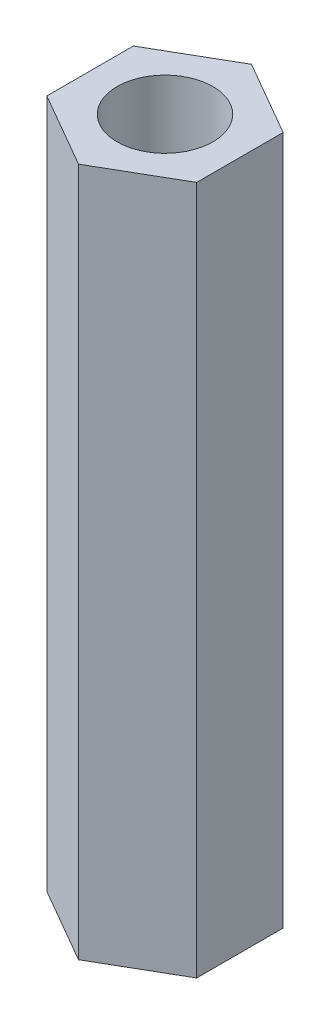
ISO-10303-21;
HEADER;
FILE_DESCRIPTION(('STEP AP214'),'2;1');
FILE_NAME('part.step','',(''),(''),'','','');
FILE_SCHEMA(('AUTOMOTIVE_DESIGN { 1 0 10303 214 1 1 1 1 }'));
ENDSEC;
DATA;
#1=APPLICATION_CONTEXT('core data for automotive mechanical design processes');
#2=APPLICATION_PROTOCOL_DEFINITION('international standard','automotive_design',2000,#1);
#3=PRODUCT_CONTEXT('',#1,'mechanical');
#4=PRODUCT('Part','Part','',(#3));
#5=PRODUCT_RELATED_PRODUCT_CATEGORY('part','',(#4));
#6=PRODUCT_DEFINITION_FORMATION('','',#4);
#7=PRODUCT_DEFINITION_CONTEXT('part definition',#1,'design');
#8=PRODUCT_DEFINITION('design','',#6,#7);
#9=PRODUCT_DEFINITION_SHAPE('','',#8);
#10=(LENGTH_UNIT() NAMED_UNIT(*) SI_UNIT(.MILLI.,.METRE.));
#11=(NAMED_UNIT(*) PLANE_ANGLE_UNIT() SI_UNIT($,.RADIAN.));
#12=(NAMED_UNIT(*) SI_UNIT($,.STERADIAN.) SOLID_ANGLE_UNIT());
#13=UNCERTAINTY_MEASURE_WITH_UNIT(LENGTH_MEASURE(1.E-05),#10,'distance_accuracy_value','');
#14=(GEOMETRIC_REPRESENTATION_CONTEXT(3) GLOBAL_UNCERTAINTY_ASSIGNED_CONTEXT((#13)) GLOBAL_UNIT_ASSIGNED_CONTEXT((#10,
#11,#12)) REPRESENTATION_CONTEXT('',''));
#15=CARTESIAN_POINT('',(0.,0.,0.));
#16=DIRECTION('',(0.,0.,1.));
#17=DIRECTION('',(1.,0.,0.));
#18=AXIS2_PLACEMENT_3D('',#15,#16,#17);
#19=CARTESIAN_POINT('',(0.,23.,0.));
#20=DIRECTION('',(0.,1.,0.));
#21=DIRECTION('',(0.,0.,1.));
#22=AXIS2_PLACEMENT_3D('',#19,#20,#21);
#23=PLANE('',#22);
#24=DIRECTION('',(-0.866025403784438,0.,-0.5));
#25=VECTOR('',#24,1.);
#26=CARTESIAN_POINT('',(2.57414627126051,23.,-2.48142347062101));
#27=LINE('',#26,#25);
#28=CARTESIAN_POINT('',(2.57414627126051,23.,-2.48142347062101));
#29=VERTEX_POINT('',#28);
#30=CARTESIAN_POINT('',(0.0741462712605112,23.,-3.92479914359508));
#31=VERTEX_POINT('',#30);
#32=EDGE_CURVE('E150',#29,#31,#27,.T.);
#33=ORIENTED_EDGE('',*,*,#32,.T.);
#34=DIRECTION('',(-0.866025403784439,0.,0.5));
#35=VECTOR('',#34,1.);
#36=CARTESIAN_POINT('',(0.0741462712605112,23.,-3.92479914359508));
#37=LINE('',#36,#35);
#38=CARTESIAN_POINT('',(-2.42585372873949,23.,-2.48142347062101));
#39=VERTEX_POINT('',#38);
#40=EDGE_CURVE('E98',#31,#39,#37,.T.);
#41=ORIENTED_EDGE('',*,*,#40,.T.);
#42=DIRECTION('',(0.,0.,1.));
#43=VECTOR('',#42,1.);
#44=CARTESIAN_POINT('',(-2.42585372873949,23.,-2.48142347062101));
#45=LINE('',#44,#43);
#46=CARTESIAN_POINT('',(-2.42585372873949,23.,0.405327875327116));
#47=VERTEX_POINT('',#46);
#48=EDGE_CURVE('E111',#39,#47,#45,.T.);
#49=ORIENTED_EDGE('',*,*,#48,.T.);
#50=DIRECTION('',(0.866025403784439,0.,0.5));
#51=VECTOR('',#50,1.);
#52=CARTESIAN_POINT('',(-2.42585372873949,23.,0.405327875327116));
#53=LINE('',#52,#51);
#54=CARTESIAN_POINT('',(0.0741462712605132,23.,1.84870354830118));
#55=VERTEX_POINT('',#54);
#56=EDGE_CURVE('E105',#47,#55,#53,.T.);
#57=ORIENTED_EDGE('',*,*,#56,.T.);
#58=DIRECTION('',(0.866025403784439,0.,-0.5));
#59=VECTOR('',#58,1.);
#60=CARTESIAN_POINT('',(0.0741462712605132,23.,1.84870354830118));
#61=LINE('',#60,#59);
#62=CARTESIAN_POINT('',(2.57414627126051,23.,0.405327875327117));
#63=VERTEX_POINT('',#62);
#64=EDGE_CURVE('E109',#55,#63,#61,.T.);
#65=ORIENTED_EDGE('',*,*,#64,.T.);
#66=DIRECTION('',(0.,0.,-1.));
#67=VECTOR('',#66,1.);
#68=CARTESIAN_POINT('',(2.57414627126051,23.,0.405327875327117));
#69=LINE('',#68,#67);
#70=EDGE_CURVE('E61',#63,#29,#69,.T.);
#71=ORIENTED_EDGE('',*,*,#70,.T.);
#72=EDGE_LOOP('',(#33,#41,#49,#57,#65,#71));
#73=FACE_BOUND('',#72,.T.);
#74=CARTESIAN_POINT('',(0.0741462712605112,23.,-1.03804779764695));
#75=DIRECTION('',(0.,1.,0.));
#76=DIRECTION('',(0.,0.,1.));
#77=AXIS2_PLACEMENT_3D('',#74,#75,#76);
#78=CIRCLE('',#77,1.6);
#79=CARTESIAN_POINT('',(0.0741462712605112,23.,0.561952202353051));
#80=VERTEX_POINT('',#79);
#81=EDGE_CURVE('E138',#80,#80,#78,.T.);
#82=ORIENTED_EDGE('',*,*,#81,.F.);
#83=EDGE_LOOP('',(#82));
#84=FACE_BOUND('',#83,.T.);
#85=ADVANCED_FACE('F43',(#73,#84),#23,.T.);
#86=CARTESIAN_POINT('',(0.,0.,0.));
#87=DIRECTION('',(0.,1.,0.));
#88=DIRECTION('',(0.,0.,1.));
#89=AXIS2_PLACEMENT_3D('',#86,#87,#88);
#90=PLANE('',#89);
#91=DIRECTION('',(-0.866025403784438,0.,-0.5));
#92=VECTOR('',#91,1.);
#93=CARTESIAN_POINT('',(2.57414627126051,0.,-2.48142347062101));
#94=LINE('',#93,#92);
#95=CARTESIAN_POINT('',(2.57414627126051,0.,-2.48142347062101));
#96=VERTEX_POINT('',#95);
#97=CARTESIAN_POINT('',(0.0741462712605112,0.,-3.92479914359508));
#98=VERTEX_POINT('',#97);
#99=EDGE_CURVE('E133',#96,#98,#94,.T.);
#100=ORIENTED_EDGE('',*,*,#99,.F.);
#101=DIRECTION('',(0.,0.,-1.));
#102=VECTOR('',#101,1.);
#103=CARTESIAN_POINT('',(2.57414627126051,0.,0.405327875327117));
#104=LINE('',#103,#102);
#105=CARTESIAN_POINT('',(2.57414627126051,0.,0.405327875327117));
#106=VERTEX_POINT('',#105);
#107=EDGE_CURVE('E90',#106,#96,#104,.T.);
#108=ORIENTED_EDGE('',*,*,#107,.F.);
#109=DIRECTION('',(0.866025403784439,0.,-0.5));
#110=VECTOR('',#109,1.);
#111=CARTESIAN_POINT('',(0.0741462712605132,0.,1.84870354830118));
#112=LINE('',#111,#110);
#113=CARTESIAN_POINT('',(0.0741462712605132,0.,1.84870354830118));
#114=VERTEX_POINT('',#113);
#115=EDGE_CURVE('E84',#114,#106,#112,.T.);
#116=ORIENTED_EDGE('',*,*,#115,.F.);
#117=DIRECTION('',(0.866025403784439,0.,0.5));
#118=VECTOR('',#117,1.);
#119=CARTESIAN_POINT('',(-2.42585372873949,0.,0.405327875327116));
#120=LINE('',#119,#118);
#121=CARTESIAN_POINT('',(-2.42585372873949,0.,0.405327875327116));
#122=VERTEX_POINT('',#121);
#123=EDGE_CURVE('E120',#122,#114,#120,.T.);
#124=ORIENTED_EDGE('',*,*,#123,.F.);
#125=DIRECTION('',(0.,0.,1.));
#126=VECTOR('',#125,1.);
#127=CARTESIAN_POINT('',(-2.42585372873949,0.,-2.48142347062101));
#128=LINE('',#127,#126);
#129=CARTESIAN_POINT('',(-2.42585372873949,0.,-2.48142347062101));
#130=VERTEX_POINT('',#129);
#131=EDGE_CURVE('E141',#130,#122,#128,.T.);
#132=ORIENTED_EDGE('',*,*,#131,.F.);
#133=DIRECTION('',(-0.866025403784439,0.,0.5));
#134=VECTOR('',#133,1.);
#135=CARTESIAN_POINT('',(0.0741462712605112,0.,-3.92479914359508));
#136=LINE('',#135,#134);
#137=EDGE_CURVE('E137',#98,#130,#136,.T.);
#138=ORIENTED_EDGE('',*,*,#137,.F.);
#139=EDGE_LOOP('',(#100,#108,#116,#124,#132,#138));
#140=FACE_BOUND('',#139,.T.);
#141=CARTESIAN_POINT('',(0.0741462712605112,0.,-1.03804779764695));
#142=DIRECTION('',(0.,1.,0.));
#143=DIRECTION('',(0.,0.,1.));
#144=AXIS2_PLACEMENT_3D('',#141,#142,#143);
#145=CIRCLE('',#144,1.6);
#146=CARTESIAN_POINT('',(0.0741462712605112,0.,0.561952202353051));
#147=VERTEX_POINT('',#146);
#148=EDGE_CURVE('E265',#147,#147,#145,.T.);
#149=ORIENTED_EDGE('',*,*,#148,.T.);
#150=EDGE_LOOP('',(#149));
#151=FACE_BOUND('',#150,.T.);
#152=ADVANCED_FACE('F163',(#140,#151),#90,.F.);
#153=CARTESIAN_POINT('',(2.57414627126051,23.,-2.48142347062101));
#154=DIRECTION('',(-0.5,0.,0.866025403784439));
#155=DIRECTION('',(0.866025403784439,0.,0.5));
#156=AXIS2_PLACEMENT_3D('',#153,#154,#155);
#157=PLANE('',#156);
#158=ORIENTED_EDGE('',*,*,#99,.T.);
#159=DIRECTION('',(0.,-1.,0.));
#160=VECTOR('',#159,1.);
#161=CARTESIAN_POINT('',(0.0741462712605112,23.,-3.92479914359508));
#162=LINE('',#161,#160);
#163=EDGE_CURVE('E11',#31,#98,#162,.T.);
#164=ORIENTED_EDGE('',*,*,#163,.F.);
#165=ORIENTED_EDGE('',*,*,#32,.F.);
#166=DIRECTION('',(0.,-1.,0.));
#167=VECTOR('',#166,1.);
#168=CARTESIAN_POINT('',(2.57414627126051,23.,-2.48142347062101));
#169=LINE('',#168,#167);
#170=EDGE_CURVE('E129',#29,#96,#169,.T.);
#171=ORIENTED_EDGE('',*,*,#170,.T.);
#172=EDGE_LOOP('',(#158,#164,#165,#171));
#173=FACE_BOUND('',#172,.T.);
#174=ADVANCED_FACE('F45',(#173),#157,.F.);
#175=CARTESIAN_POINT('',(0.0741462712605112,23.,-3.92479914359508));
#176=DIRECTION('',(0.5,0.,0.866025403784439));
#177=DIRECTION('',(0.866025403784439,0.,-0.5));
#178=AXIS2_PLACEMENT_3D('',#175,#176,#177);
#179=PLANE('',#178);
#180=ORIENTED_EDGE('',*,*,#137,.T.);
#181=DIRECTION('',(0.,-1.,0.));
#182=VECTOR('',#181,1.);
#183=CARTESIAN_POINT('',(-2.42585372873949,23.,-2.48142347062101));
#184=LINE('',#183,#182);
#185=EDGE_CURVE('E53',#39,#130,#184,.T.);
#186=ORIENTED_EDGE('',*,*,#185,.F.);
#187=ORIENTED_EDGE('',*,*,#40,.F.);
#188=ORIENTED_EDGE('',*,*,#163,.T.);
#189=EDGE_LOOP('',(#180,#186,#187,#188));
#190=FACE_BOUND('',#189,.T.);
#191=ADVANCED_FACE('F188',(#190),#179,.F.);
#192=CARTESIAN_POINT('',(-2.42585372873949,23.,-2.48142347062101));
#193=DIRECTION('',(1.,0.,0.));
#194=DIRECTION('',(0.,0.,-1.));
#195=AXIS2_PLACEMENT_3D('',#192,#193,#194);
#196=PLANE('',#195);
#197=ORIENTED_EDGE('',*,*,#131,.T.);
#198=DIRECTION('',(0.,-1.,0.));
#199=VECTOR('',#198,1.);
#200=CARTESIAN_POINT('',(-2.42585372873949,23.,0.405327875327116));
#201=LINE('',#200,#199);
#202=EDGE_CURVE('E122',#47,#122,#201,.T.);
#203=ORIENTED_EDGE('',*,*,#202,.F.);
#204=ORIENTED_EDGE('',*,*,#48,.F.);
#205=ORIENTED_EDGE('',*,*,#185,.T.);
#206=EDGE_LOOP('',(#197,#203,#204,#205));
#207=FACE_BOUND('',#206,.T.);
#208=ADVANCED_FACE('F160',(#207),#196,.F.);
#209=CARTESIAN_POINT('',(-2.42585372873949,23.,0.405327875327116));
#210=DIRECTION('',(0.5,0.,-0.866025403784439));
#211=DIRECTION('',(-0.866025403784439,0.,-0.5));
#212=AXIS2_PLACEMENT_3D('',#209,#210,#211);
#213=PLANE('',#212);
#214=ORIENTED_EDGE('',*,*,#123,.T.);
#215=DIRECTION('',(0.,-1.,0.));
#216=VECTOR('',#215,1.);
#217=CARTESIAN_POINT('',(0.0741462712605132,23.,1.84870354830118));
#218=LINE('',#217,#216);
#219=EDGE_CURVE('E117',#55,#114,#218,.T.);
#220=ORIENTED_EDGE('',*,*,#219,.F.);
#221=ORIENTED_EDGE('',*,*,#56,.F.);
#222=ORIENTED_EDGE('',*,*,#202,.T.);
#223=EDGE_LOOP('',(#214,#220,#221,#222));
#224=FACE_BOUND('',#223,.T.);
#225=ADVANCED_FACE('F118',(#224),#213,.F.);
#226=CARTESIAN_POINT('',(0.0741462712605132,23.,1.84870354830118));
#227=DIRECTION('',(-0.5,0.,-0.866025403784439));
#228=DIRECTION('',(-0.866025403784439,0.,0.5));
#229=AXIS2_PLACEMENT_3D('',#226,#227,#228);
#230=PLANE('',#229);
#231=ORIENTED_EDGE('',*,*,#115,.T.);
#232=DIRECTION('',(0.,-1.,0.));
#233=VECTOR('',#232,1.);
#234=CARTESIAN_POINT('',(2.57414627126051,23.,0.405327875327117));
#235=LINE('',#234,#233);
#236=EDGE_CURVE('E123',#63,#106,#235,.T.);
#237=ORIENTED_EDGE('',*,*,#236,.F.);
#238=ORIENTED_EDGE('',*,*,#64,.F.);
#239=ORIENTED_EDGE('',*,*,#219,.T.);
#240=EDGE_LOOP('',(#231,#237,#238,#239));
#241=FACE_BOUND('',#240,.T.);
#242=ADVANCED_FACE('F125',(#241),#230,.F.);
#243=CARTESIAN_POINT('',(2.57414627126051,23.,0.405327875327117));
#244=DIRECTION('',(-1.,0.,0.));
#245=DIRECTION('',(0.,0.,1.));
#246=AXIS2_PLACEMENT_3D('',#243,#244,#245);
#247=PLANE('',#246);
#248=ORIENTED_EDGE('',*,*,#107,.T.);
#249=ORIENTED_EDGE('',*,*,#170,.F.);
#250=ORIENTED_EDGE('',*,*,#70,.F.);
#251=ORIENTED_EDGE('',*,*,#236,.T.);
#252=EDGE_LOOP('',(#248,#249,#250,#251));
#253=FACE_BOUND('',#252,.T.);
#254=ADVANCED_FACE('F168',(#253),#247,.F.);
#255=CARTESIAN_POINT('',(0.0741462712605112,23.,-1.03804779764695));
#256=DIRECTION('',(0.,-1.,0.));
#257=DIRECTION('',(0.,0.,-1.));
#258=AXIS2_PLACEMENT_3D('',#255,#256,#257);
#259=CYLINDRICAL_SURFACE('',#258,1.6);
#260=ORIENTED_EDGE('',*,*,#81,.T.);
#261=EDGE_LOOP('',(#260));
#262=FACE_BOUND('',#261,.T.);
#263=ORIENTED_EDGE('',*,*,#148,.F.);
#264=EDGE_LOOP('',(#263));
#265=FACE_BOUND('',#264,.T.);
#266=ADVANCED_FACE('F170',(#262,#265),#259,.F.);
#267=CLOSED_SHELL('',(#85,#152,#174,#191,#208,#225,#242,#254,#266));
#268=MANIFOLD_SOLID_BREP('B2',#267);
#269=ADVANCED_BREP_SHAPE_REPRESENTATION('',(#18,#268),#14);
#270=SHAPE_DEFINITION_REPRESENTATION(#9,#269);
ENDSEC;
END-ISO-10303-21;
